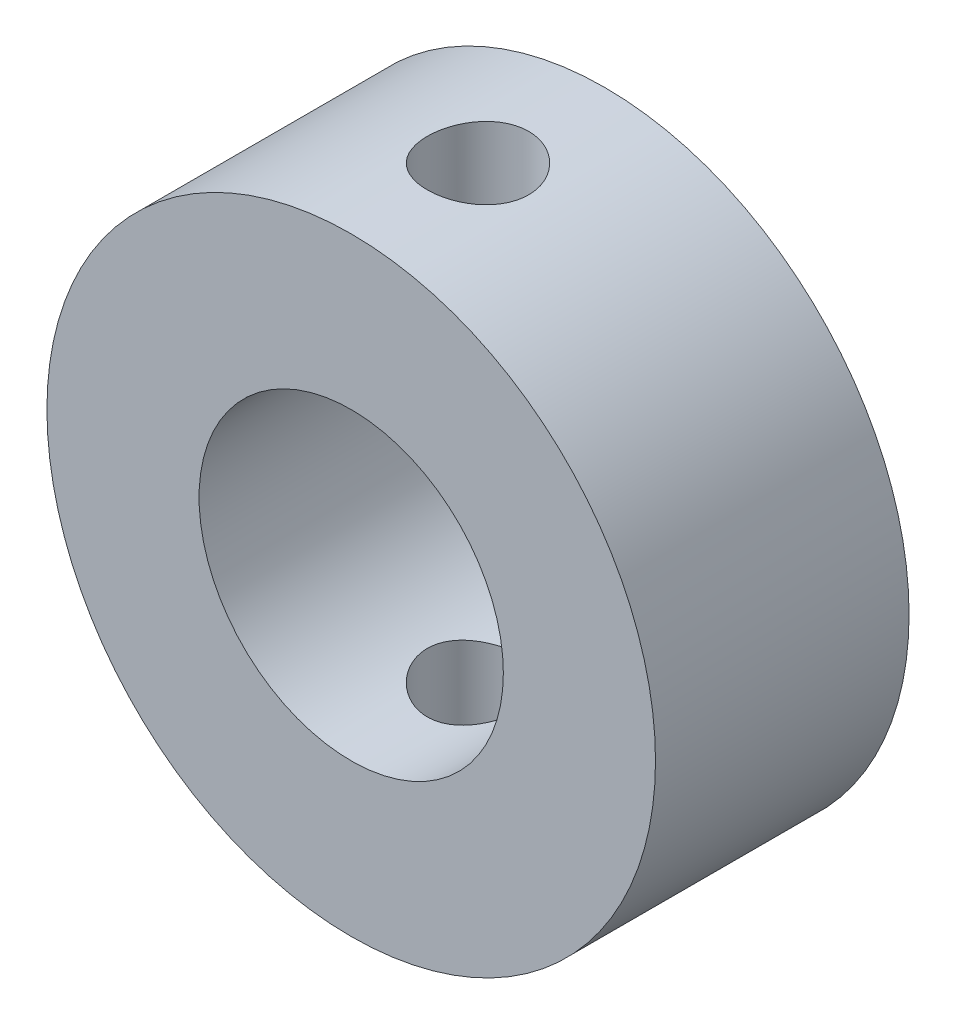
ISO-10303-21;
HEADER;
FILE_DESCRIPTION(('STEP AP214'),'2;1');
FILE_NAME('part.step','',(''),(''),'','','');
FILE_SCHEMA(('AUTOMOTIVE_DESIGN { 1 0 10303 214 1 1 1 1 }'));
ENDSEC;
DATA;
#1=APPLICATION_CONTEXT('core data for automotive mechanical design processes');
#2=APPLICATION_PROTOCOL_DEFINITION('international standard','automotive_design',2000,#1);
#3=PRODUCT_CONTEXT('',#1,'mechanical');
#4=PRODUCT('Part','Part','',(#3));
#5=PRODUCT_RELATED_PRODUCT_CATEGORY('part','',(#4));
#6=PRODUCT_DEFINITION_FORMATION('','',#4);
#7=PRODUCT_DEFINITION_CONTEXT('part definition',#1,'design');
#8=PRODUCT_DEFINITION('design','',#6,#7);
#9=PRODUCT_DEFINITION_SHAPE('','',#8);
#10=(LENGTH_UNIT() NAMED_UNIT(*) SI_UNIT(.MILLI.,.METRE.));
#11=(NAMED_UNIT(*) PLANE_ANGLE_UNIT() SI_UNIT($,.RADIAN.));
#12=(NAMED_UNIT(*) SI_UNIT($,.STERADIAN.) SOLID_ANGLE_UNIT());
#13=UNCERTAINTY_MEASURE_WITH_UNIT(LENGTH_MEASURE(1.E-05),#10,'distance_accuracy_value','');
#14=(GEOMETRIC_REPRESENTATION_CONTEXT(3) GLOBAL_UNCERTAINTY_ASSIGNED_CONTEXT((#13)) GLOBAL_UNIT_ASSIGNED_CONTEXT((#10,
#11,#12)) REPRESENTATION_CONTEXT('',''));
#15=CARTESIAN_POINT('',(0.,0.,0.));
#16=DIRECTION('',(0.,0.,1.));
#17=DIRECTION('',(1.,0.,0.));
#18=AXIS2_PLACEMENT_3D('',#15,#16,#17);
#19=CARTESIAN_POINT('',(0.,0.,5.));
#20=DIRECTION('',(0.,0.,-1.));
#21=DIRECTION('',(-1.,0.,0.));
#22=AXIS2_PLACEMENT_3D('',#19,#20,#21);
#23=CYLINDRICAL_SURFACE('',#22,6.);
#24=CARTESIAN_POINT('',(0.,0.,5.));
#25=DIRECTION('',(0.,0.,1.));
#26=DIRECTION('',(1.,0.,0.));
#27=AXIS2_PLACEMENT_3D('',#24,#25,#26);
#28=CIRCLE('',#27,6.);
#29=CARTESIAN_POINT('',(6.,0.,5.));
#30=VERTEX_POINT('',#29);
#31=EDGE_CURVE('E10',#30,#30,#28,.T.);
#32=ORIENTED_EDGE('',*,*,#31,.F.);
#33=EDGE_LOOP('',(#32));
#34=FACE_BOUND('',#33,.T.);
#35=CARTESIAN_POINT('',(0.,0.,0.));
#36=DIRECTION('',(0.,0.,1.));
#37=DIRECTION('',(1.,0.,0.));
#38=AXIS2_PLACEMENT_3D('',#35,#36,#37);
#39=CIRCLE('',#38,6.);
#40=CARTESIAN_POINT('',(6.,0.,0.));
#41=VERTEX_POINT('',#40);
#42=EDGE_CURVE('E45',#41,#41,#39,.T.);
#43=ORIENTED_EDGE('',*,*,#42,.T.);
#44=EDGE_LOOP('',(#43));
#45=FACE_BOUND('',#44,.T.);
#46=CARTESIAN_POINT('',(0.,-6.,1.5));
#47=CARTESIAN_POINT('',(0.0557563619832859,-5.9999990446753,1.50000223557913));
#48=CARTESIAN_POINT('',(0.111543152735528,-5.99921471165214,1.50467890998757));
#49=CARTESIAN_POINT('',(0.221552088669217,-5.99616137976555,1.52325426350613));
#50=CARTESIAN_POINT('',(0.275772747183699,-5.99389101569556,1.53716142276464));
#51=CARTESIAN_POINT('',(0.381041898885057,-5.9881202729458,1.5737661794371));
#52=CARTESIAN_POINT('',(0.43209294737276,-5.98462090063677,1.59645658625623));
#53=CARTESIAN_POINT('',(0.529656736791178,-5.97677690832828,1.64996491682096));
#54=CARTESIAN_POINT('',(0.576169995951436,-5.97243238501774,1.6807819109932));
#55=CARTESIAN_POINT('',(0.663789045716672,-5.96333326983325,1.74998203352818));
#56=CARTESIAN_POINT('',(0.704845161413987,-5.95857548725943,1.78842764585445));
#57=CARTESIAN_POINT('',(0.779955399463971,-5.94921050750693,1.87165918738912));
#58=CARTESIAN_POINT('',(0.814009079756388,-5.94460331985067,1.91644551658264));
#59=CARTESIAN_POINT('',(0.874346850242053,-5.93603026303912,2.01142838647882));
#60=CARTESIAN_POINT('',(0.900581821144401,-5.93206851636655,2.0616565347219));
#61=CARTESIAN_POINT('',(0.944223346164488,-5.9252791591787,2.16588382572025));
#62=CARTESIAN_POINT('',(0.961630496626245,-5.92245147205723,2.21988271347105));
#63=CARTESIAN_POINT('',(0.986965751113923,-5.91828214737102,2.32959210994262));
#64=CARTESIAN_POINT('',(0.994979611654161,-5.9169270739428,2.38528229460056));
#65=CARTESIAN_POINT('',(1.00156669011595,-5.9158157557466,2.49723211075339));
#66=CARTESIAN_POINT('',(1.0001405761556,-5.91605939782886,2.55349170166692));
#67=CARTESIAN_POINT('',(0.987958039358461,-5.91810571545422,2.66437114451018));
#68=CARTESIAN_POINT('',(0.977297952755909,-5.91989229327567,2.71900192141809));
#69=CARTESIAN_POINT('',(0.947101256161378,-5.92479798084403,2.82568852713165));
#70=CARTESIAN_POINT('',(0.927564341727897,-5.92791713629309,2.87774426755542));
#71=CARTESIAN_POINT('',(0.880070898437565,-5.9351539173364,2.97809152937637));
#72=CARTESIAN_POINT('',(0.852074365551886,-5.9392762684293,3.02636376243249));
#73=CARTESIAN_POINT('',(0.788484807022974,-5.94805167366004,3.11756176021535));
#74=CARTESIAN_POINT('',(0.752891168261715,-5.95270477061714,3.16048709298197));
#75=CARTESIAN_POINT('',(0.674592884863622,-5.96208811151914,3.24033043432294));
#76=CARTESIAN_POINT('',(0.631805585549251,-5.96681859692661,3.27716740741603));
#77=CARTESIAN_POINT('',(0.540614099592659,-5.97577040558689,3.34315110506614));
#78=CARTESIAN_POINT('',(0.492209876762569,-5.97999172555898,3.37229778007329));
#79=CARTESIAN_POINT('',(0.391082366466685,-5.98745557157165,3.42208089085451));
#80=CARTESIAN_POINT('',(0.338355490225865,-5.99069727362979,3.4427101677325));
#81=CARTESIAN_POINT('',(0.230119338241093,-5.99583001205064,3.47479768609839));
#82=CARTESIAN_POINT('',(0.174610295671788,-5.9977211614019,3.48625669478949));
#83=CARTESIAN_POINT('',(0.0630839605206499,-5.99992451937074,3.49956854338445));
#84=CARTESIAN_POINT('',(0.00708029486040503,-6.00025501205114,3.50153262872224));
#85=CARTESIAN_POINT('',(-0.104455909155954,-5.99934989768468,3.49609546222875));
#86=CARTESIAN_POINT('',(-0.159988465556815,-5.99811435089647,3.48869457074651));
#87=CARTESIAN_POINT('',(-0.268662470218705,-5.99422730775281,3.46483006026581));
#88=CARTESIAN_POINT('',(-0.321816347354151,-5.99158441920525,3.44842151664395));
#89=CARTESIAN_POINT('',(-0.424618753944176,-5.98517785782144,3.40706619272019));
#90=CARTESIAN_POINT('',(-0.474267086363887,-5.98141412204808,3.38211893294589));
#91=CARTESIAN_POINT('',(-0.569132275787583,-5.97313806520963,3.32413955012129));
#92=CARTESIAN_POINT('',(-0.614306100374859,-5.96861942354809,3.2910379375331));
#93=CARTESIAN_POINT('',(-0.698497434201075,-5.9593538695676,3.21778507384598));
#94=CARTESIAN_POINT('',(-0.737514495878633,-5.95460694068619,3.17763331068933));
#95=CARTESIAN_POINT('',(-0.8086971118632,-5.94536070094338,3.09092098077143));
#96=CARTESIAN_POINT('',(-0.840787504445485,-5.94086446454842,3.04429833379424));
#97=CARTESIAN_POINT('',(-0.896680924117994,-5.93268611911154,2.94625881234459));
#98=CARTESIAN_POINT('',(-0.920484213907929,-5.92900398426408,2.894842089909));
#99=CARTESIAN_POINT('',(-0.959015332589259,-5.92289381479082,2.78888410687515));
#100=CARTESIAN_POINT('',(-0.973780573019178,-5.92046061724426,2.73435676198781));
#101=CARTESIAN_POINT('',(-0.993934181511311,-5.91711086734104,2.6235519483113));
#102=CARTESIAN_POINT('',(-0.999323364778467,-5.91619418313089,2.56727463210718));
#103=CARTESIAN_POINT('',(-1.00054914641894,-5.91598693233605,2.45531793361504));
#104=CARTESIAN_POINT('',(-0.996504054450075,-5.9166762260226,2.39963984856989));
#105=CARTESIAN_POINT('',(-0.979231935582739,-5.91955912581491,2.28976830077969));
#106=CARTESIAN_POINT('',(-0.966004938444991,-5.92175272704486,2.23557483322325));
#107=CARTESIAN_POINT('',(-0.930789795837961,-5.92738942512688,2.13025662508295));
#108=CARTESIAN_POINT('',(-0.908811836240177,-5.93083106887868,2.07912839597759));
#109=CARTESIAN_POINT('',(-0.856730801566363,-5.93857747568883,1.98126573232206));
#110=CARTESIAN_POINT('',(-0.826627323499425,-5.9428822815536,1.93453151585115));
#111=CARTESIAN_POINT('',(-0.758727553748862,-5.95193381618249,1.8461857667569));
#112=CARTESIAN_POINT('',(-0.720844225437459,-5.95668518230521,1.80464159331989));
#113=CARTESIAN_POINT('',(-0.638643612552092,-5.96605748944336,1.72845935821003));
#114=CARTESIAN_POINT('',(-0.594324845165055,-5.97067840010619,1.69382289254473));
#115=CARTESIAN_POINT('',(-0.500147667856113,-5.97930611856888,1.63222069272002));
#116=CARTESIAN_POINT('',(-0.450253115013128,-5.98330846501242,1.60530958427482));
#117=CARTESIAN_POINT('',(-0.346605227751593,-5.9902046704071,1.56029220615603));
#118=CARTESIAN_POINT('',(-0.292855797932004,-5.99309963270993,1.54217716756812));
#119=CARTESIAN_POINT('',(-0.19908132401816,-5.99682316333182,1.51919789034933));
#120=CARTESIAN_POINT('',(-0.159623532119379,-5.99800810909344,1.51201021215361));
#121=CARTESIAN_POINT('',(-0.0801157241279237,-5.99959686394448,1.5024105048621));
#122=CARTESIAN_POINT('',(-0.0400657182433977,-6.00000068648257,1.49999839354506));
#123=CARTESIAN_POINT('',(0.,-6.,1.5));
#124=B_SPLINE_CURVE_WITH_KNOTS('',3,(#46,#47,#48,#49,#50,#51,#52,#53,#54,#55,#56,#57,#58,#59,
#60,#61,#62,#63,#64,#65,#66,#67,#68,#69,#70,#71,#72,#73,#74,#75,#76,#77,#78,#79,#80,#81,#82,#83,
#84,#85,#86,#87,#88,#89,#90,#91,#92,#93,#94,#95,#96,#97,#98,#99,#100,#101,#102,#103,#104,#105,
#106,#107,#108,#109,#110,#111,#112,#113,#114,#115,#116,#117,#118,#119,#120,#121,#122,#123),
.UNSPECIFIED.,.T.,.F.,(4,2,2,2,2,2,2,2,2,2,2,2,2,2,2,2,2,2,2,2,2,2,2,2,2,2,2,2,2,2,2,2,2,2,2,2,
2,2,4),(0.,0.167122633975404,0.334399018278168,0.501538746810108,0.668659365069916,
0.837209964249328,1.00577120067943,1.17537008329536,1.34495750750472,1.51298430841369,
1.68099921728355,1.84728208704163,2.01357066010152,2.18065822653023,2.34775928272229,
2.51693107964531,2.68610396654339,2.85541875566361,3.02471937808459,3.19203153396559,
3.35933725214344,3.52563122802566,3.69193454330427,3.85970730250809,4.02749225221713,
4.19701528803048,4.36653294950377,4.53534408936709,4.70414055114647,4.8708316380908,
5.03752218475253,5.20401927290489,5.37052462011734,5.53900553677357,5.70752533551589,
5.8772089264288,6.04672300852029,6.16681699265607,6.28690890910787),.UNSPECIFIED.);
#125=CARTESIAN_POINT('',(0.,-6.,1.5));
#126=VERTEX_POINT('',#125);
#127=EDGE_CURVE('E73',#126,#126,#124,.T.);
#128=ORIENTED_EDGE('',*,*,#127,.F.);
#129=EDGE_LOOP('',(#128));
#130=FACE_BOUND('',#129,.T.);
#131=CARTESIAN_POINT('',(0.,6.,1.5));
#132=CARTESIAN_POINT('',(-0.0557563619832859,5.9999990446753,1.50000223557913));
#133=CARTESIAN_POINT('',(-0.111543152735528,5.99921471165214,1.50467890998757));
#134=CARTESIAN_POINT('',(-0.221552088669217,5.99616137976555,1.52325426350613));
#135=CARTESIAN_POINT('',(-0.275772747183699,5.99389101569556,1.53716142276464));
#136=CARTESIAN_POINT('',(-0.381041898885057,5.9881202729458,1.5737661794371));
#137=CARTESIAN_POINT('',(-0.43209294737276,5.98462090063677,1.59645658625623));
#138=CARTESIAN_POINT('',(-0.529656736791178,5.97677690832828,1.64996491682096));
#139=CARTESIAN_POINT('',(-0.576169995951436,5.97243238501774,1.6807819109932));
#140=CARTESIAN_POINT('',(-0.663789045716672,5.96333326983325,1.74998203352818));
#141=CARTESIAN_POINT('',(-0.704845161413987,5.95857548725943,1.78842764585445));
#142=CARTESIAN_POINT('',(-0.779955399463971,5.94921050750693,1.87165918738912));
#143=CARTESIAN_POINT('',(-0.814009079756388,5.94460331985067,1.91644551658264));
#144=CARTESIAN_POINT('',(-0.874346850242053,5.93603026303912,2.01142838647882));
#145=CARTESIAN_POINT('',(-0.900581821144401,5.93206851636655,2.0616565347219));
#146=CARTESIAN_POINT('',(-0.944223346164488,5.9252791591787,2.16588382572025));
#147=CARTESIAN_POINT('',(-0.961630496626245,5.92245147205723,2.21988271347105));
#148=CARTESIAN_POINT('',(-0.986965751113923,5.91828214737102,2.32959210994262));
#149=CARTESIAN_POINT('',(-0.994979611654161,5.9169270739428,2.38528229460056));
#150=CARTESIAN_POINT('',(-1.00156669011595,5.9158157557466,2.49723211075339));
#151=CARTESIAN_POINT('',(-1.0001405761556,5.91605939782886,2.55349170166692));
#152=CARTESIAN_POINT('',(-0.987958039358461,5.91810571545422,2.66437114451018));
#153=CARTESIAN_POINT('',(-0.977297952755909,5.91989229327567,2.71900192141809));
#154=CARTESIAN_POINT('',(-0.947101256161378,5.92479798084403,2.82568852713165));
#155=CARTESIAN_POINT('',(-0.927564341727897,5.92791713629309,2.87774426755542));
#156=CARTESIAN_POINT('',(-0.880070898437565,5.9351539173364,2.97809152937637));
#157=CARTESIAN_POINT('',(-0.852074365551886,5.9392762684293,3.02636376243249));
#158=CARTESIAN_POINT('',(-0.788484807022974,5.94805167366004,3.11756176021535));
#159=CARTESIAN_POINT('',(-0.752891168261715,5.95270477061714,3.16048709298197));
#160=CARTESIAN_POINT('',(-0.674592884863622,5.96208811151914,3.24033043432294));
#161=CARTESIAN_POINT('',(-0.631805585549251,5.96681859692661,3.27716740741603));
#162=CARTESIAN_POINT('',(-0.540614099592659,5.97577040558689,3.34315110506614));
#163=CARTESIAN_POINT('',(-0.492209876762569,5.97999172555898,3.37229778007329));
#164=CARTESIAN_POINT('',(-0.391082366466685,5.98745557157165,3.42208089085451));
#165=CARTESIAN_POINT('',(-0.338355490225865,5.99069727362979,3.4427101677325));
#166=CARTESIAN_POINT('',(-0.230119338241093,5.99583001205064,3.47479768609839));
#167=CARTESIAN_POINT('',(-0.174610295671788,5.9977211614019,3.48625669478949));
#168=CARTESIAN_POINT('',(-0.0630839605206499,5.99992451937074,3.49956854338445));
#169=CARTESIAN_POINT('',(-0.00708029486040503,6.00025501205114,3.50153262872224));
#170=CARTESIAN_POINT('',(0.104455909155954,5.99934989768468,3.49609546222875));
#171=CARTESIAN_POINT('',(0.159988465556815,5.99811435089647,3.48869457074651));
#172=CARTESIAN_POINT('',(0.268662470218705,5.99422730775281,3.46483006026581));
#173=CARTESIAN_POINT('',(0.321816347354151,5.99158441920525,3.44842151664395));
#174=CARTESIAN_POINT('',(0.424618753944176,5.98517785782144,3.40706619272019));
#175=CARTESIAN_POINT('',(0.474267086363887,5.98141412204808,3.38211893294589));
#176=CARTESIAN_POINT('',(0.569132275787583,5.97313806520963,3.32413955012129));
#177=CARTESIAN_POINT('',(0.614306100374859,5.96861942354809,3.2910379375331));
#178=CARTESIAN_POINT('',(0.698497434201075,5.9593538695676,3.21778507384598));
#179=CARTESIAN_POINT('',(0.737514495878633,5.95460694068619,3.17763331068933));
#180=CARTESIAN_POINT('',(0.8086971118632,5.94536070094338,3.09092098077143));
#181=CARTESIAN_POINT('',(0.840787504445485,5.94086446454842,3.04429833379424));
#182=CARTESIAN_POINT('',(0.896680924117994,5.93268611911154,2.94625881234459));
#183=CARTESIAN_POINT('',(0.920484213907929,5.92900398426408,2.894842089909));
#184=CARTESIAN_POINT('',(0.959015332589259,5.92289381479082,2.78888410687515));
#185=CARTESIAN_POINT('',(0.973780573019178,5.92046061724426,2.73435676198781));
#186=CARTESIAN_POINT('',(0.993934181511311,5.91711086734104,2.6235519483113));
#187=CARTESIAN_POINT('',(0.999323364778467,5.91619418313089,2.56727463210718));
#188=CARTESIAN_POINT('',(1.00054914641894,5.91598693233605,2.45531793361504));
#189=CARTESIAN_POINT('',(0.996504054450075,5.9166762260226,2.39963984856989));
#190=CARTESIAN_POINT('',(0.979231935582739,5.91955912581491,2.28976830077969));
#191=CARTESIAN_POINT('',(0.966004938444991,5.92175272704486,2.23557483322325));
#192=CARTESIAN_POINT('',(0.930789795837961,5.92738942512688,2.13025662508295));
#193=CARTESIAN_POINT('',(0.908811836240177,5.93083106887868,2.07912839597759));
#194=CARTESIAN_POINT('',(0.856730801566363,5.93857747568883,1.98126573232206));
#195=CARTESIAN_POINT('',(0.826627323499425,5.9428822815536,1.93453151585115));
#196=CARTESIAN_POINT('',(0.758727553748862,5.95193381618249,1.8461857667569));
#197=CARTESIAN_POINT('',(0.720844225437459,5.95668518230521,1.80464159331989));
#198=CARTESIAN_POINT('',(0.638643612552092,5.96605748944336,1.72845935821003));
#199=CARTESIAN_POINT('',(0.594324845165055,5.97067840010619,1.69382289254473));
#200=CARTESIAN_POINT('',(0.500147667856113,5.97930611856888,1.63222069272002));
#201=CARTESIAN_POINT('',(0.450253115013128,5.98330846501242,1.60530958427482));
#202=CARTESIAN_POINT('',(0.346605227751593,5.9902046704071,1.56029220615603));
#203=CARTESIAN_POINT('',(0.292855797932004,5.99309963270993,1.54217716756812));
#204=CARTESIAN_POINT('',(0.19908132401816,5.99682316333182,1.51919789034933));
#205=CARTESIAN_POINT('',(0.159623532119379,5.99800810909344,1.51201021215361));
#206=CARTESIAN_POINT('',(0.0801157241279237,5.99959686394448,1.5024105048621));
#207=CARTESIAN_POINT('',(0.0400657182433977,6.00000068648257,1.49999839354506));
#208=CARTESIAN_POINT('',(0.,6.,1.5));
#209=B_SPLINE_CURVE_WITH_KNOTS('',3,(#131,#132,#133,#134,#135,#136,#137,#138,#139,#140,#141,
#142,#143,#144,#145,#146,#147,#148,#149,#150,#151,#152,#153,#154,#155,#156,#157,#158,#159,#160,
#161,#162,#163,#164,#165,#166,#167,#168,#169,#170,#171,#172,#173,#174,#175,#176,#177,#178,#179,
#180,#181,#182,#183,#184,#185,#186,#187,#188,#189,#190,#191,#192,#193,#194,#195,#196,#197,#198,
#199,#200,#201,#202,#203,#204,#205,#206,#207,#208),.UNSPECIFIED.,.T.,.F.,(4,2,2,2,2,2,2,2,2,2,2,
2,2,2,2,2,2,2,2,2,2,2,2,2,2,2,2,2,2,2,2,2,2,2,2,2,2,2,4),(0.,0.167122633975404,
0.334399018278168,0.501538746810108,0.668659365069916,0.837209964249328,1.00577120067943,
1.17537008329536,1.34495750750472,1.51298430841369,1.68099921728355,1.84728208704163,
2.01357066010152,2.18065822653023,2.34775928272229,2.51693107964531,2.68610396654339,
2.85541875566361,3.02471937808459,3.19203153396559,3.35933725214344,3.52563122802566,
3.69193454330427,3.85970730250809,4.02749225221713,4.19701528803048,4.36653294950377,
4.53534408936709,4.70414055114647,4.8708316380908,5.03752218475253,5.20401927290489,
5.37052462011734,5.53900553677357,5.70752533551589,5.8772089264288,6.04672300852029,
6.16681699265607,6.28690890910787),.UNSPECIFIED.);
#210=CARTESIAN_POINT('',(0.,6.,1.5));
#211=VERTEX_POINT('',#210);
#212=EDGE_CURVE('E78',#211,#211,#209,.T.);
#213=ORIENTED_EDGE('',*,*,#212,.F.);
#214=EDGE_LOOP('',(#213));
#215=FACE_BOUND('',#214,.T.);
#216=ADVANCED_FACE('F32',(#34,#45,#130,#215),#23,.T.);
#217=CARTESIAN_POINT('',(0.,0.,5.));
#218=DIRECTION('',(0.,0.,-1.));
#219=DIRECTION('',(-1.,0.,0.));
#220=AXIS2_PLACEMENT_3D('',#217,#218,#219);
#221=CYLINDRICAL_SURFACE('',#220,3.);
#222=CARTESIAN_POINT('',(0.,-3.,1.5));
#223=CARTESIAN_POINT('',(0.0545633628867233,-3.00000015300943,1.49999974626836));
#224=CARTESIAN_POINT('',(0.10912519453855,-2.99849769507545,1.50448026612722));
#225=CARTESIAN_POINT('',(0.216641760872972,-2.99265210203281,1.52222910881722));
#226=CARTESIAN_POINT('',(0.269596328118818,-2.98830867202153,1.53549834394892));
#227=CARTESIAN_POINT('',(0.372332789501776,-2.97725307906443,1.57031924338405));
#228=CARTESIAN_POINT('',(0.422119825886034,-2.97054487730853,1.59185706245927));
#229=CARTESIAN_POINT('',(0.517374936805324,-2.95544445717342,1.64254117283835));
#230=CARTESIAN_POINT('',(0.562842156958706,-2.94705190667778,1.6716889650026));
#231=CARTESIAN_POINT('',(0.649741675022266,-2.92914094443005,1.73782580485875));
#232=CARTESIAN_POINT('',(0.691003700298309,-2.91959556463785,1.77503123426049));
#233=CARTESIAN_POINT('',(0.766832692702084,-2.90060314783122,1.85576715470657));
#234=CARTESIAN_POINT('',(0.801398185489462,-2.89115613290549,1.89929903492851));
#235=CARTESIAN_POINT('',(0.863824942227859,-2.87313332477274,1.99298511519646));
#236=CARTESIAN_POINT('',(0.891464858221032,-2.86459039275688,2.04329373973212));
#237=CARTESIAN_POINT('',(0.937818873877721,-2.84975305418601,2.14817609445855));
#238=CARTESIAN_POINT('',(0.956535697386765,-2.84345796160746,2.20274851716274));
#239=CARTESIAN_POINT('',(0.983873461509163,-2.83411303269377,2.31267322149671));
#240=CARTESIAN_POINT('',(0.992813448271769,-2.83096095769611,2.36793720848906));
#241=CARTESIAN_POINT('',(1.00134112333448,-2.82795656629508,2.47926375415588));
#242=CARTESIAN_POINT('',(1.00093170160472,-2.8281032302273,2.53532606070919));
#243=CARTESIAN_POINT('',(0.991019903703419,-2.8315901500818,2.64393663044402));
#244=CARTESIAN_POINT('',(0.981933913166995,-2.83478415867533,2.69652840291902));
#245=CARTESIAN_POINT('',(0.955606162849417,-2.84376657724551,2.79939341960683));
#246=CARTESIAN_POINT('',(0.938363426591871,-2.84955529784108,2.84966638543507));
#247=CARTESIAN_POINT('',(0.895939058060211,-2.86317911131249,2.94741274959148));
#248=CARTESIAN_POINT('',(0.870634048707263,-2.87104565793117,2.99482802546953));
#249=CARTESIAN_POINT('',(0.812889106303139,-2.88792558575726,3.08487090827973));
#250=CARTESIAN_POINT('',(0.780447112364006,-2.89693929790464,3.12749712693338));
#251=CARTESIAN_POINT('',(0.707349332682237,-2.91567329167741,3.20909159816077));
#252=CARTESIAN_POINT('',(0.666353150076311,-2.92540589354843,3.24775269450907));
#253=CARTESIAN_POINT('',(0.578339569970064,-2.94406938387037,3.3177312666634));
#254=CARTESIAN_POINT('',(0.531321595660814,-2.95300019538067,3.3490480381645));
#255=CARTESIAN_POINT('',(0.431947613046267,-2.96917107937794,3.40369630023507));
#256=CARTESIAN_POINT('',(0.379543276416336,-2.97639350008039,3.42694549134073));
#257=CARTESIAN_POINT('',(0.271269083364507,-2.98820567144435,3.46420317395571));
#258=CARTESIAN_POINT('',(0.215400438154954,-2.99279633654879,3.47821487542344));
#259=CARTESIAN_POINT('',(0.104383829529304,-2.99867627071441,3.49605566602236));
#260=CARTESIAN_POINT('',(0.0493095998648451,-3.00010001833731,3.50029980917275));
#261=CARTESIAN_POINT('',(-0.0607750699602366,-2.99988902694825,3.49966732640153));
#262=CARTESIAN_POINT('',(-0.115785519319647,-2.99825480419352,3.49479224002013));
#263=CARTESIAN_POINT('',(-0.222519866304259,-2.99220024717114,3.47638809226403));
#264=CARTESIAN_POINT('',(-0.274292806834856,-2.98786198711228,3.46311379395048));
#265=CARTESIAN_POINT('',(-0.374855958579561,-2.97691846830034,3.4286065555333));
#266=CARTESIAN_POINT('',(-0.423645788508559,-2.97031292046541,3.40737260053232));
#267=CARTESIAN_POINT('',(-0.518288296393322,-2.95528931287427,3.3569295681591));
#268=CARTESIAN_POINT('',(-0.56402995921733,-2.94682814756305,3.3275254067164));
#269=CARTESIAN_POINT('',(-0.650064830135404,-2.92905253915743,3.26180584998695));
#270=CARTESIAN_POINT('',(-0.690356367794894,-2.91973783591888,3.22548834396984));
#271=CARTESIAN_POINT('',(-0.766252507807013,-2.90076847982472,3.14502124899174));
#272=CARTESIAN_POINT('',(-0.801560969248491,-2.89111761095155,3.10059077306675));
#273=CARTESIAN_POINT('',(-0.864257522320854,-2.87299973286981,3.0062284321955));
#274=CARTESIAN_POINT('',(-0.891645547920843,-2.8645327335312,2.9562965213898));
#275=CARTESIAN_POINT('',(-0.937596930423361,-2.84982391820308,2.85232698469341));
#276=CARTESIAN_POINT('',(-0.956178132197766,-2.84357760900632,2.79829792075722));
#277=CARTESIAN_POINT('',(-0.983894666792163,-2.83410832399133,2.68762134987585));
#278=CARTESIAN_POINT('',(-0.993034254961244,-2.83088398622698,2.63097503456694));
#279=CARTESIAN_POINT('',(-1.00127628247038,-2.82797858875071,2.51980290398679));
#280=CARTESIAN_POINT('',(-1.00087025731093,-2.82812400344299,2.46531765974826));
#281=CARTESIAN_POINT('',(-0.991242293454878,-2.8315126992356,2.35723492510026));
#282=CARTESIAN_POINT('',(-0.982020879458887,-2.83475579595884,2.30363738204709));
#283=CARTESIAN_POINT('',(-0.95537181312698,-2.84384524278943,2.19986433698733));
#284=CARTESIAN_POINT('',(-0.938103346014879,-2.84964098015514,2.14964317499277));
#285=CARTESIAN_POINT('',(-0.895979365760381,-2.86316398825434,2.05277259306447));
#286=CARTESIAN_POINT('',(-0.871122168553979,-2.87089168765297,2.00612396881274));
#287=CARTESIAN_POINT('',(-0.813260692583248,-2.8878282922406,1.91551633007631));
#288=CARTESIAN_POINT('',(-0.779948242764531,-2.89708711641604,1.8717634981014));
#289=CARTESIAN_POINT('',(-0.706642883135697,-2.91583356283786,1.79031018661601));
#290=CARTESIAN_POINT('',(-0.666648084451495,-2.92532124912518,1.75261142431198));
#291=CARTESIAN_POINT('',(-0.579241556920674,-2.94390030525393,1.68285558771076));
#292=CARTESIAN_POINT('',(-0.531601513499724,-2.95296181801216,1.65107565224898));
#293=CARTESIAN_POINT('',(-0.431357357406628,-2.96925991172652,1.59600957114937));
#294=CARTESIAN_POINT('',(-0.378754518132349,-2.9764969590794,1.57272125407796));
#295=CARTESIAN_POINT('',(-0.272493647200974,-2.98805515068532,1.53627836751132));
#296=CARTESIAN_POINT('',(-0.218987757676408,-2.9924921242252,1.52271753373662));
#297=CARTESIAN_POINT('',(-0.110320416010247,-2.99846407064225,1.50457971932287));
#298=CARTESIAN_POINT('',(-0.0551594255687465,-2.99999984531906,1.50000025650346));
#299=CARTESIAN_POINT('',(0.,-3.,1.5));
#300=B_SPLINE_CURVE_WITH_KNOTS('',3,(#222,#223,#224,#225,#226,#227,#228,#229,#230,#231,#232,
#233,#234,#235,#236,#237,#238,#239,#240,#241,#242,#243,#244,#245,#246,#247,#248,#249,#250,#251,
#252,#253,#254,#255,#256,#257,#258,#259,#260,#261,#262,#263,#264,#265,#266,#267,#268,#269,#270,
#271,#272,#273,#274,#275,#276,#277,#278,#279,#280,#281,#282,#283,#284,#285,#286,#287,#288,#289,
#290,#291,#292,#293,#294,#295,#296,#297,#298,#299),.UNSPECIFIED.,.T.,.F.,(4,2,2,2,2,2,2,2,2,2,2,
2,2,2,2,2,2,2,2,2,2,2,2,2,2,2,2,2,2,2,2,2,2,2,2,2,2,2,4),(0.,0.163487106026011,
0.326991185267521,0.490222672870274,0.6534863777991,0.821846842827559,0.990244332875302,
1.1634838482347,1.33667044692833,1.5040192574184,1.67131633987485,1.8309682655128,
1.99063930855482,2.15288171155131,2.31517102558207,2.48593305811367,2.65671145966618,
2.82918405650358,3.00159668877208,3.1665358317517,3.33144713164177,3.49158157978213,
3.65173645284104,3.81610399843736,3.98052180821891,4.15241022880752,4.32430008234997,
4.49584013824416,4.66730284700846,4.82995666056619,4.99260079341185,5.15215587070228,
5.31174638165788,5.47830066681615,5.64490211113589,5.8179966082491,5.99104681142266,
6.15636558363624,6.3216386602795),.UNSPECIFIED.);
#301=CARTESIAN_POINT('',(0.,-3.,1.5));
#302=VERTEX_POINT('',#301);
#303=EDGE_CURVE('E55',#302,#302,#300,.T.);
#304=ORIENTED_EDGE('',*,*,#303,.T.);
#305=EDGE_LOOP('',(#304));
#306=FACE_BOUND('',#305,.T.);
#307=CARTESIAN_POINT('',(0.,0.,5.));
#308=DIRECTION('',(0.,0.,1.));
#309=DIRECTION('',(1.,0.,0.));
#310=AXIS2_PLACEMENT_3D('',#307,#308,#309);
#311=CIRCLE('',#310,3.);
#312=CARTESIAN_POINT('',(3.,0.,5.));
#313=VERTEX_POINT('',#312);
#314=EDGE_CURVE('E50',#313,#313,#311,.T.);
#315=ORIENTED_EDGE('',*,*,#314,.T.);
#316=EDGE_LOOP('',(#315));
#317=FACE_BOUND('',#316,.T.);
#318=CARTESIAN_POINT('',(0.,0.,0.));
#319=DIRECTION('',(0.,0.,1.));
#320=DIRECTION('',(1.,0.,0.));
#321=AXIS2_PLACEMENT_3D('',#318,#319,#320);
#322=CIRCLE('',#321,3.);
#323=CARTESIAN_POINT('',(3.,0.,0.));
#324=VERTEX_POINT('',#323);
#325=EDGE_CURVE('E53',#324,#324,#322,.T.);
#326=ORIENTED_EDGE('',*,*,#325,.F.);
#327=EDGE_LOOP('',(#326));
#328=FACE_BOUND('',#327,.T.);
#329=CARTESIAN_POINT('',(0.,3.,1.5));
#330=CARTESIAN_POINT('',(-0.0545633628867233,3.00000015300943,1.49999974626836));
#331=CARTESIAN_POINT('',(-0.10912519453855,2.99849769507545,1.50448026612722));
#332=CARTESIAN_POINT('',(-0.216641760872972,2.99265210203281,1.52222910881722));
#333=CARTESIAN_POINT('',(-0.269596328118818,2.98830867202153,1.53549834394892));
#334=CARTESIAN_POINT('',(-0.372332789501776,2.97725307906443,1.57031924338405));
#335=CARTESIAN_POINT('',(-0.422119825886034,2.97054487730853,1.59185706245927));
#336=CARTESIAN_POINT('',(-0.517374936805324,2.95544445717342,1.64254117283835));
#337=CARTESIAN_POINT('',(-0.562842156958706,2.94705190667778,1.6716889650026));
#338=CARTESIAN_POINT('',(-0.649741675022266,2.92914094443005,1.73782580485875));
#339=CARTESIAN_POINT('',(-0.691003700298309,2.91959556463785,1.77503123426049));
#340=CARTESIAN_POINT('',(-0.766832692702084,2.90060314783122,1.85576715470657));
#341=CARTESIAN_POINT('',(-0.801398185489462,2.89115613290549,1.89929903492851));
#342=CARTESIAN_POINT('',(-0.863824942227859,2.87313332477274,1.99298511519646));
#343=CARTESIAN_POINT('',(-0.891464858221032,2.86459039275688,2.04329373973212));
#344=CARTESIAN_POINT('',(-0.937818873877721,2.84975305418601,2.14817609445855));
#345=CARTESIAN_POINT('',(-0.956535697386765,2.84345796160746,2.20274851716274));
#346=CARTESIAN_POINT('',(-0.983873461509163,2.83411303269377,2.31267322149671));
#347=CARTESIAN_POINT('',(-0.992813448271769,2.83096095769611,2.36793720848906));
#348=CARTESIAN_POINT('',(-1.00134112333448,2.82795656629508,2.47926375415588));
#349=CARTESIAN_POINT('',(-1.00093170160472,2.8281032302273,2.53532606070919));
#350=CARTESIAN_POINT('',(-0.991019903703419,2.8315901500818,2.64393663044402));
#351=CARTESIAN_POINT('',(-0.981933913166995,2.83478415867533,2.69652840291902));
#352=CARTESIAN_POINT('',(-0.955606162849417,2.84376657724551,2.79939341960683));
#353=CARTESIAN_POINT('',(-0.938363426591871,2.84955529784108,2.84966638543507));
#354=CARTESIAN_POINT('',(-0.895939058060211,2.86317911131249,2.94741274959148));
#355=CARTESIAN_POINT('',(-0.870634048707263,2.87104565793117,2.99482802546953));
#356=CARTESIAN_POINT('',(-0.812889106303139,2.88792558575726,3.08487090827973));
#357=CARTESIAN_POINT('',(-0.780447112364006,2.89693929790464,3.12749712693338));
#358=CARTESIAN_POINT('',(-0.707349332682237,2.91567329167741,3.20909159816077));
#359=CARTESIAN_POINT('',(-0.666353150076311,2.92540589354843,3.24775269450907));
#360=CARTESIAN_POINT('',(-0.578339569970064,2.94406938387037,3.3177312666634));
#361=CARTESIAN_POINT('',(-0.531321595660814,2.95300019538067,3.3490480381645));
#362=CARTESIAN_POINT('',(-0.431947613046267,2.96917107937794,3.40369630023507));
#363=CARTESIAN_POINT('',(-0.379543276416336,2.97639350008039,3.42694549134073));
#364=CARTESIAN_POINT('',(-0.271269083364507,2.98820567144435,3.46420317395571));
#365=CARTESIAN_POINT('',(-0.215400438154954,2.99279633654879,3.47821487542344));
#366=CARTESIAN_POINT('',(-0.104383829529304,2.99867627071441,3.49605566602236));
#367=CARTESIAN_POINT('',(-0.0493095998648451,3.00010001833731,3.50029980917275));
#368=CARTESIAN_POINT('',(0.0607750699602366,2.99988902694825,3.49966732640153));
#369=CARTESIAN_POINT('',(0.115785519319647,2.99825480419352,3.49479224002013));
#370=CARTESIAN_POINT('',(0.222519866304259,2.99220024717114,3.47638809226403));
#371=CARTESIAN_POINT('',(0.274292806834856,2.98786198711228,3.46311379395048));
#372=CARTESIAN_POINT('',(0.374855958579561,2.97691846830034,3.4286065555333));
#373=CARTESIAN_POINT('',(0.423645788508559,2.97031292046541,3.40737260053232));
#374=CARTESIAN_POINT('',(0.518288296393322,2.95528931287427,3.3569295681591));
#375=CARTESIAN_POINT('',(0.56402995921733,2.94682814756305,3.3275254067164));
#376=CARTESIAN_POINT('',(0.650064830135404,2.92905253915743,3.26180584998695));
#377=CARTESIAN_POINT('',(0.690356367794894,2.91973783591888,3.22548834396984));
#378=CARTESIAN_POINT('',(0.766252507807013,2.90076847982472,3.14502124899174));
#379=CARTESIAN_POINT('',(0.801560969248491,2.89111761095155,3.10059077306675));
#380=CARTESIAN_POINT('',(0.864257522320854,2.87299973286981,3.0062284321955));
#381=CARTESIAN_POINT('',(0.891645547920843,2.8645327335312,2.9562965213898));
#382=CARTESIAN_POINT('',(0.937596930423361,2.84982391820308,2.85232698469341));
#383=CARTESIAN_POINT('',(0.956178132197766,2.84357760900632,2.79829792075722));
#384=CARTESIAN_POINT('',(0.983894666792163,2.83410832399133,2.68762134987585));
#385=CARTESIAN_POINT('',(0.993034254961244,2.83088398622698,2.63097503456694));
#386=CARTESIAN_POINT('',(1.00127628247038,2.82797858875071,2.51980290398679));
#387=CARTESIAN_POINT('',(1.00087025731093,2.82812400344299,2.46531765974826));
#388=CARTESIAN_POINT('',(0.991242293454878,2.8315126992356,2.35723492510026));
#389=CARTESIAN_POINT('',(0.982020879458887,2.83475579595884,2.30363738204709));
#390=CARTESIAN_POINT('',(0.95537181312698,2.84384524278943,2.19986433698733));
#391=CARTESIAN_POINT('',(0.938103346014879,2.84964098015514,2.14964317499277));
#392=CARTESIAN_POINT('',(0.895979365760381,2.86316398825434,2.05277259306447));
#393=CARTESIAN_POINT('',(0.871122168553979,2.87089168765297,2.00612396881274));
#394=CARTESIAN_POINT('',(0.813260692583248,2.8878282922406,1.91551633007631));
#395=CARTESIAN_POINT('',(0.779948242764531,2.89708711641604,1.8717634981014));
#396=CARTESIAN_POINT('',(0.706642883135697,2.91583356283786,1.79031018661601));
#397=CARTESIAN_POINT('',(0.666648084451495,2.92532124912518,1.75261142431198));
#398=CARTESIAN_POINT('',(0.579241556920674,2.94390030525393,1.68285558771076));
#399=CARTESIAN_POINT('',(0.531601513499724,2.95296181801216,1.65107565224898));
#400=CARTESIAN_POINT('',(0.431357357406628,2.96925991172652,1.59600957114937));
#401=CARTESIAN_POINT('',(0.378754518132349,2.9764969590794,1.57272125407796));
#402=CARTESIAN_POINT('',(0.272493647200974,2.98805515068532,1.53627836751132));
#403=CARTESIAN_POINT('',(0.218987757676408,2.9924921242252,1.52271753373662));
#404=CARTESIAN_POINT('',(0.110320416010247,2.99846407064225,1.50457971932287));
#405=CARTESIAN_POINT('',(0.0551594255687465,2.99999984531906,1.50000025650346));
#406=CARTESIAN_POINT('',(0.,3.,1.5));
#407=B_SPLINE_CURVE_WITH_KNOTS('',3,(#329,#330,#331,#332,#333,#334,#335,#336,#337,#338,#339,
#340,#341,#342,#343,#344,#345,#346,#347,#348,#349,#350,#351,#352,#353,#354,#355,#356,#357,#358,
#359,#360,#361,#362,#363,#364,#365,#366,#367,#368,#369,#370,#371,#372,#373,#374,#375,#376,#377,
#378,#379,#380,#381,#382,#383,#384,#385,#386,#387,#388,#389,#390,#391,#392,#393,#394,#395,#396,
#397,#398,#399,#400,#401,#402,#403,#404,#405,#406),.UNSPECIFIED.,.T.,.F.,(4,2,2,2,2,2,2,2,2,2,2,
2,2,2,2,2,2,2,2,2,2,2,2,2,2,2,2,2,2,2,2,2,2,2,2,2,2,2,4),(0.,0.163487106026011,
0.326991185267521,0.490222672870274,0.6534863777991,0.821846842827559,0.990244332875302,
1.1634838482347,1.33667044692833,1.5040192574184,1.67131633987485,1.8309682655128,
1.99063930855482,2.15288171155131,2.31517102558207,2.48593305811367,2.65671145966618,
2.82918405650358,3.00159668877208,3.1665358317517,3.33144713164177,3.49158157978213,
3.65173645284104,3.81610399843736,3.98052180821891,4.15241022880752,4.32430008234997,
4.49584013824416,4.66730284700846,4.82995666056619,4.99260079341185,5.15215587070228,
5.31174638165788,5.47830066681615,5.64490211113589,5.8179966082491,5.99104681142266,
6.15636558363624,6.3216386602795),.UNSPECIFIED.);
#408=CARTESIAN_POINT('',(0.,3.,1.5));
#409=VERTEX_POINT('',#408);
#410=EDGE_CURVE('E36',#409,#409,#407,.T.);
#411=ORIENTED_EDGE('',*,*,#410,.T.);
#412=EDGE_LOOP('',(#411));
#413=FACE_BOUND('',#412,.T.);
#414=ADVANCED_FACE('F60',(#306,#317,#328,#413),#221,.F.);
#415=CARTESIAN_POINT('',(0.,0.,5.));
#416=DIRECTION('',(0.,0.,1.));
#417=DIRECTION('',(1.,0.,0.));
#418=AXIS2_PLACEMENT_3D('',#415,#416,#417);
#419=PLANE('',#418);
#420=ORIENTED_EDGE('',*,*,#31,.T.);
#421=EDGE_LOOP('',(#420));
#422=FACE_BOUND('',#421,.T.);
#423=ORIENTED_EDGE('',*,*,#314,.F.);
#424=EDGE_LOOP('',(#423));
#425=FACE_BOUND('',#424,.T.);
#426=ADVANCED_FACE('F93',(#422,#425),#419,.T.);
#427=CARTESIAN_POINT('',(0.,0.,0.));
#428=DIRECTION('',(0.,0.,1.));
#429=DIRECTION('',(1.,0.,0.));
#430=AXIS2_PLACEMENT_3D('',#427,#428,#429);
#431=PLANE('',#430);
#432=ORIENTED_EDGE('',*,*,#42,.F.);
#433=EDGE_LOOP('',(#432));
#434=FACE_BOUND('',#433,.T.);
#435=ORIENTED_EDGE('',*,*,#325,.T.);
#436=EDGE_LOOP('',(#435));
#437=FACE_BOUND('',#436,.T.);
#438=ADVANCED_FACE('F89',(#434,#437),#431,.F.);
#439=CARTESIAN_POINT('',(0.,10.,2.5));
#440=DIRECTION('',(0.,-1.,0.));
#441=DIRECTION('',(0.,0.,-1.));
#442=AXIS2_PLACEMENT_3D('',#439,#440,#441);
#443=CYLINDRICAL_SURFACE('',#442,1.);
#444=ORIENTED_EDGE('',*,*,#303,.F.);
#445=EDGE_LOOP('',(#444));
#446=FACE_BOUND('',#445,.T.);
#447=ORIENTED_EDGE('',*,*,#127,.T.);
#448=EDGE_LOOP('',(#447));
#449=FACE_BOUND('',#448,.T.);
#450=ADVANCED_FACE('F66',(#446,#449),#443,.F.);
#451=ORIENTED_EDGE('',*,*,#410,.F.);
#452=EDGE_LOOP('',(#451));
#453=FACE_BOUND('',#452,.T.);
#454=ORIENTED_EDGE('',*,*,#212,.T.);
#455=EDGE_LOOP('',(#454));
#456=FACE_BOUND('',#455,.T.);
#457=ADVANCED_FACE('F63',(#453,#456),#443,.F.);
#458=CLOSED_SHELL('',(#216,#414,#426,#438,#450,#457));
#459=MANIFOLD_SOLID_BREP('B2',#458);
#460=ADVANCED_BREP_SHAPE_REPRESENTATION('',(#18,#459),#14);
#461=SHAPE_DEFINITION_REPRESENTATION(#9,#460);
ENDSEC;
END-ISO-10303-21;
